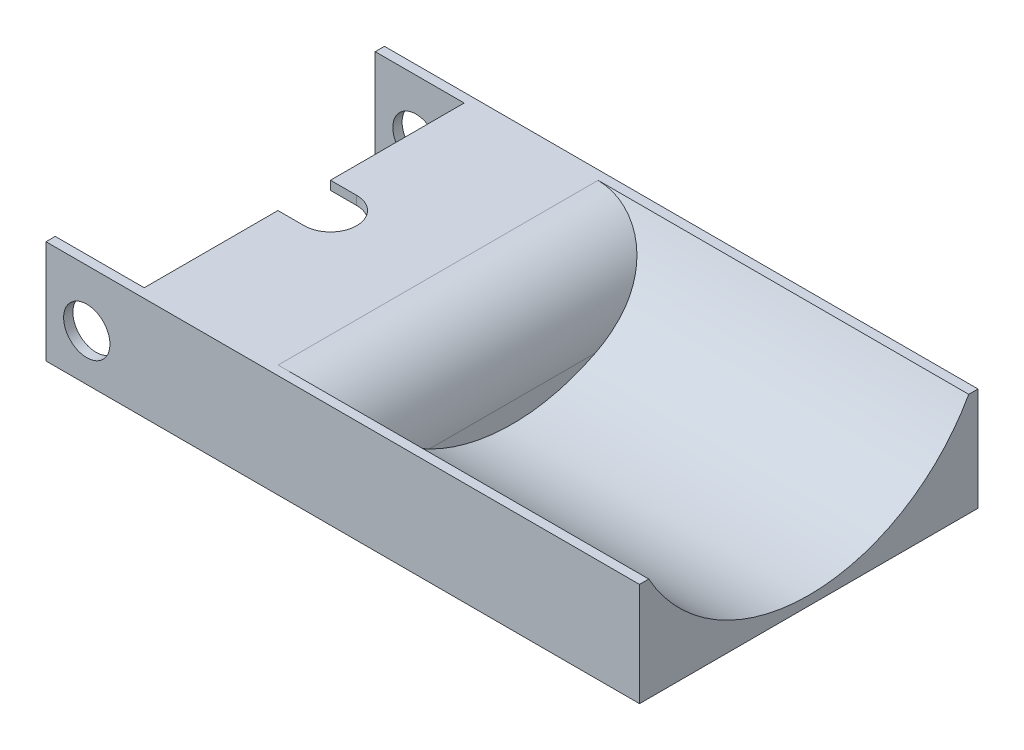
ISO-10303-21;
HEADER;
FILE_DESCRIPTION(('STEP AP214'),'2;1');
FILE_NAME('part.step','',(''),(''),'','','');
FILE_SCHEMA(('AUTOMOTIVE_DESIGN { 1 0 10303 214 1 1 1 1 }'));
ENDSEC;
DATA;
#1=APPLICATION_CONTEXT('core data for automotive mechanical design processes');
#2=APPLICATION_PROTOCOL_DEFINITION('international standard','automotive_design',2000,#1);
#3=PRODUCT_CONTEXT('',#1,'mechanical');
#4=PRODUCT('Part','Part','',(#3));
#5=PRODUCT_RELATED_PRODUCT_CATEGORY('part','',(#4));
#6=PRODUCT_DEFINITION_FORMATION('','',#4);
#7=PRODUCT_DEFINITION_CONTEXT('part definition',#1,'design');
#8=PRODUCT_DEFINITION('design','',#6,#7);
#9=PRODUCT_DEFINITION_SHAPE('','',#8);
#10=(LENGTH_UNIT() NAMED_UNIT(*) SI_UNIT(.MILLI.,.METRE.));
#11=(NAMED_UNIT(*) PLANE_ANGLE_UNIT() SI_UNIT($,.RADIAN.));
#12=(NAMED_UNIT(*) SI_UNIT($,.STERADIAN.) SOLID_ANGLE_UNIT());
#13=UNCERTAINTY_MEASURE_WITH_UNIT(LENGTH_MEASURE(1.E-05),#10,'distance_accuracy_value','');
#14=(GEOMETRIC_REPRESENTATION_CONTEXT(3) GLOBAL_UNCERTAINTY_ASSIGNED_CONTEXT((#13)) GLOBAL_UNIT_ASSIGNED_CONTEXT((#10,
#11,#12)) REPRESENTATION_CONTEXT('',''));
#15=CARTESIAN_POINT('',(0.,0.,0.));
#16=DIRECTION('',(0.,0.,1.));
#17=DIRECTION('',(1.,0.,0.));
#18=AXIS2_PLACEMENT_3D('',#15,#16,#17);
#19=CARTESIAN_POINT('',(15.24,-118.14937,-27.4066));
#20=DIRECTION('',(1.,0.,0.));
#21=DIRECTION('',(0.,0.,-1.));
#22=AXIS2_PLACEMENT_3D('',#19,#20,#21);
#23=PLANE('',#22);
#24=DIRECTION('',(0.,0.,-1.));
#25=VECTOR('',#24,1.);
#26=CARTESIAN_POINT('',(15.24,7.34187,-27.4066));
#27=LINE('',#26,#25);
#28=CARTESIAN_POINT('',(15.24,7.34186999999999,-4.49961));
#29=VERTEX_POINT('',#28);
#30=CARTESIAN_POINT('',(15.24,7.34187,-27.4066));
#31=VERTEX_POINT('',#30);
#32=EDGE_CURVE('E340',#29,#31,#27,.T.);
#33=ORIENTED_EDGE('',*,*,#32,.F.);
#34=DIRECTION('',(0.,1.,0.));
#35=VECTOR('',#34,1.);
#36=CARTESIAN_POINT('',(15.24,-118.14937,-4.49961000000002));
#37=LINE('',#36,#35);
#38=CARTESIAN_POINT('',(15.24,8.85063,-4.49961));
#39=VERTEX_POINT('',#38);
#40=EDGE_CURVE('E234',#29,#39,#37,.T.);
#41=ORIENTED_EDGE('',*,*,#40,.T.);
#42=DIRECTION('',(0.,0.,-1.));
#43=VECTOR('',#42,1.);
#44=CARTESIAN_POINT('',(15.24,8.85063,-27.4066));
#45=LINE('',#44,#43);
#46=CARTESIAN_POINT('',(15.24,8.85063,-27.4066));
#47=VERTEX_POINT('',#46);
#48=EDGE_CURVE('E377',#39,#47,#45,.T.);
#49=ORIENTED_EDGE('',*,*,#48,.T.);
#50=DIRECTION('',(0.,1.,0.));
#51=VECTOR('',#50,1.);
#52=CARTESIAN_POINT('',(15.24,-118.14937,-27.4066));
#53=LINE('',#52,#51);
#54=EDGE_CURVE('E182',#31,#47,#53,.T.);
#55=ORIENTED_EDGE('',*,*,#54,.F.);
#56=EDGE_LOOP('',(#33,#41,#49,#55));
#57=FACE_BOUND('',#56,.T.);
#58=ADVANCED_FACE('F39',(#57),#23,.F.);
#59=CARTESIAN_POINT('',(0.,-118.14937,-4.49961000000001));
#60=DIRECTION('',(0.,0.,-1.));
#61=DIRECTION('',(-1.,0.,0.));
#62=AXIS2_PLACEMENT_3D('',#59,#60,#61);
#63=PLANE('',#62);
#64=DIRECTION('',(1.,0.,0.));
#65=VECTOR('',#64,1.);
#66=CARTESIAN_POINT('',(101.681600522714,7.34186999999999,-4.49961000000002));
#67=LINE('',#66,#65);
#68=CARTESIAN_POINT('',(19.73961,7.34187,-4.49961));
#69=VERTEX_POINT('',#68);
#70=EDGE_CURVE('E176',#29,#69,#67,.T.);
#71=ORIENTED_EDGE('',*,*,#70,.T.);
#72=DIRECTION('',(0.,1.,0.));
#73=VECTOR('',#72,1.);
#74=CARTESIAN_POINT('',(19.73961,-118.14937,-4.49961000000002));
#75=LINE('',#74,#73);
#76=CARTESIAN_POINT('',(19.73961,8.85063,-4.49961));
#77=VERTEX_POINT('',#76);
#78=EDGE_CURVE('E373',#69,#77,#75,.T.);
#79=ORIENTED_EDGE('',*,*,#78,.T.);
#80=DIRECTION('',(-1.,0.,0.));
#81=VECTOR('',#80,1.);
#82=CARTESIAN_POINT('',(0.,8.85063,-4.49961));
#83=LINE('',#82,#81);
#84=EDGE_CURVE('E369',#77,#39,#83,.T.);
#85=ORIENTED_EDGE('',*,*,#84,.T.);
#86=ORIENTED_EDGE('',*,*,#40,.F.);
#87=EDGE_LOOP('',(#71,#79,#85,#86));
#88=FACE_BOUND('',#87,.T.);
#89=ADVANCED_FACE('F258',(#88),#63,.F.);
#90=CARTESIAN_POINT('',(19.73961,-118.14937,0.));
#91=DIRECTION('',(0.,1.,0.));
#92=DIRECTION('',(0.,0.,1.));
#93=AXIS2_PLACEMENT_3D('',#90,#91,#92);
#94=CYLINDRICAL_SURFACE('',#93,4.49961);
#95=CARTESIAN_POINT('',(19.73961,7.34187,0.));
#96=DIRECTION('',(0.,-1.,0.));
#97=DIRECTION('',(0.,0.,-1.));
#98=AXIS2_PLACEMENT_3D('',#95,#96,#97);
#99=CIRCLE('',#98,4.49961);
#100=CARTESIAN_POINT('',(19.73961,7.34187,4.49961));
#101=VERTEX_POINT('',#100);
#102=EDGE_CURVE('E166',#69,#101,#99,.T.);
#103=ORIENTED_EDGE('',*,*,#102,.T.);
#104=DIRECTION('',(0.,1.,0.));
#105=VECTOR('',#104,1.);
#106=CARTESIAN_POINT('',(19.73961,-118.14937,4.49960999999999));
#107=LINE('',#106,#105);
#108=CARTESIAN_POINT('',(19.73961,8.85063,4.49961));
#109=VERTEX_POINT('',#108);
#110=EDGE_CURVE('E372',#101,#109,#107,.T.);
#111=ORIENTED_EDGE('',*,*,#110,.T.);
#112=CARTESIAN_POINT('',(19.73961,8.85063,0.));
#113=DIRECTION('',(0.,1.,0.));
#114=DIRECTION('',(0.,0.,1.));
#115=AXIS2_PLACEMENT_3D('',#112,#113,#114);
#116=CIRCLE('',#115,4.49961);
#117=EDGE_CURVE('E366',#109,#77,#116,.T.);
#118=ORIENTED_EDGE('',*,*,#117,.T.);
#119=ORIENTED_EDGE('',*,*,#78,.F.);
#120=EDGE_LOOP('',(#103,#111,#118,#119));
#121=FACE_BOUND('',#120,.T.);
#122=ADVANCED_FACE('F262',(#121),#94,.F.);
#123=CARTESIAN_POINT('',(0.,-118.14937,4.49960999999998));
#124=DIRECTION('',(0.,0.,-1.));
#125=DIRECTION('',(-1.,0.,0.));
#126=AXIS2_PLACEMENT_3D('',#123,#124,#125);
#127=PLANE('',#126);
#128=ORIENTED_EDGE('',*,*,#110,.F.);
#129=DIRECTION('',(1.,0.,0.));
#130=VECTOR('',#129,1.);
#131=CARTESIAN_POINT('',(101.681600522714,7.34186999999999,4.49961000000002));
#132=LINE('',#131,#130);
#133=CARTESIAN_POINT('',(15.24,7.34187,4.49961));
#134=VERTEX_POINT('',#133);
#135=EDGE_CURVE('E175',#134,#101,#132,.T.);
#136=ORIENTED_EDGE('',*,*,#135,.F.);
#137=DIRECTION('',(0.,1.,0.));
#138=VECTOR('',#137,1.);
#139=CARTESIAN_POINT('',(15.24,-118.14937,4.49960999999999));
#140=LINE('',#139,#138);
#141=CARTESIAN_POINT('',(15.24,8.85063,4.49961));
#142=VERTEX_POINT('',#141);
#143=EDGE_CURVE('E174',#134,#142,#140,.T.);
#144=ORIENTED_EDGE('',*,*,#143,.T.);
#145=DIRECTION('',(-1.,0.,0.));
#146=VECTOR('',#145,1.);
#147=CARTESIAN_POINT('',(0.,8.85063,4.49961));
#148=LINE('',#147,#146);
#149=EDGE_CURVE('E362',#109,#142,#148,.T.);
#150=ORIENTED_EDGE('',*,*,#149,.F.);
#151=EDGE_LOOP('',(#128,#136,#144,#150));
#152=FACE_BOUND('',#151,.T.);
#153=ADVANCED_FACE('F266',(#152),#127,.T.);
#154=ORIENTED_EDGE('',*,*,#143,.F.);
#155=DIRECTION('',(0.,0.,1.));
#156=VECTOR('',#155,1.);
#157=CARTESIAN_POINT('',(15.24,7.34187,-28.9941));
#158=LINE('',#157,#156);
#159=CARTESIAN_POINT('',(15.24,7.34186999999999,27.4066));
#160=VERTEX_POINT('',#159);
#161=EDGE_CURVE('E56',#134,#160,#158,.T.);
#162=ORIENTED_EDGE('',*,*,#161,.T.);
#163=DIRECTION('',(0.,1.,0.));
#164=VECTOR('',#163,1.);
#165=CARTESIAN_POINT('',(15.24,-118.14937,27.4066));
#166=LINE('',#165,#164);
#167=CARTESIAN_POINT('',(15.24,8.85062999999999,27.4066));
#168=VERTEX_POINT('',#167);
#169=EDGE_CURVE('E172',#160,#168,#166,.T.);
#170=ORIENTED_EDGE('',*,*,#169,.T.);
#171=EDGE_CURVE('E187',#168,#142,#45,.T.);
#172=ORIENTED_EDGE('',*,*,#171,.T.);
#173=EDGE_LOOP('',(#154,#162,#170,#172));
#174=FACE_BOUND('',#173,.T.);
#175=ADVANCED_FACE('F170',(#174),#23,.F.);
#176=CARTESIAN_POINT('',(0.,0.,0.));
#177=DIRECTION('',(-1.,0.,0.));
#178=DIRECTION('',(0.,0.,1.));
#179=AXIS2_PLACEMENT_3D('',#176,#177,#178);
#180=PLANE('',#179);
#181=DIRECTION('',(0.,-1.,0.));
#182=VECTOR('',#181,1.);
#183=CARTESIAN_POINT('',(0.,0.,-27.4066));
#184=LINE('',#183,#182);
#185=CARTESIAN_POINT('',(0.,8.85063,-27.4066));
#186=VERTEX_POINT('',#185);
#187=CARTESIAN_POINT('',(0.,-8.85063000000001,-27.4066));
#188=VERTEX_POINT('',#187);
#189=EDGE_CURVE('E231',#186,#188,#184,.T.);
#190=ORIENTED_EDGE('',*,*,#189,.F.);
#191=DIRECTION('',(0.,0.,1.));
#192=VECTOR('',#191,1.);
#193=CARTESIAN_POINT('',(0.,8.85063,-28.9941));
#194=LINE('',#193,#192);
#195=CARTESIAN_POINT('',(0.,8.85063,-28.9941));
#196=VERTEX_POINT('',#195);
#197=EDGE_CURVE('E198',#196,#186,#194,.T.);
#198=ORIENTED_EDGE('',*,*,#197,.F.);
#199=DIRECTION('',(0.,-1.,0.));
#200=VECTOR('',#199,1.);
#201=CARTESIAN_POINT('',(0.,8.85063,-28.9941));
#202=LINE('',#201,#200);
#203=CARTESIAN_POINT('',(0.,-8.85063,-28.9941));
#204=VERTEX_POINT('',#203);
#205=EDGE_CURVE('E193',#196,#204,#202,.T.);
#206=ORIENTED_EDGE('',*,*,#205,.T.);
#207=DIRECTION('',(0.,0.,1.));
#208=VECTOR('',#207,1.);
#209=CARTESIAN_POINT('',(0.,-8.85063,-28.9941));
#210=LINE('',#209,#208);
#211=EDGE_CURVE('E211',#204,#188,#210,.T.);
#212=ORIENTED_EDGE('',*,*,#211,.T.);
#213=EDGE_LOOP('',(#190,#198,#206,#212));
#214=FACE_BOUND('',#213,.T.);
#215=ADVANCED_FACE('F290',(#214),#180,.T.);
#216=CARTESIAN_POINT('',(101.681600522714,8.85063,-28.9941));
#217=DIRECTION('',(0.,0.,-1.));
#218=DIRECTION('',(0.,1.,0.));
#219=AXIS2_PLACEMENT_3D('',#216,#217,#218);
#220=PLANE('',#219);
#221=CARTESIAN_POINT('',(6.985,-0.890269999999998,-28.9941));
#222=DIRECTION('',(0.,0.,-1.));
#223=DIRECTION('',(0.,1.,0.));
#224=AXIS2_PLACEMENT_3D('',#221,#222,#223);
#225=CIRCLE('',#224,3.96875);
#226=CARTESIAN_POINT('',(6.985,3.07848,-28.9941));
#227=VERTEX_POINT('',#226);
#228=EDGE_CURVE('E310',#227,#227,#225,.T.);
#229=ORIENTED_EDGE('',*,*,#228,.F.);
#230=EDGE_LOOP('',(#229));
#231=FACE_BOUND('',#230,.T.);
#232=ORIENTED_EDGE('',*,*,#205,.F.);
#233=DIRECTION('',(-1.,0.,0.));
#234=VECTOR('',#233,1.);
#235=CARTESIAN_POINT('',(101.681600522714,8.85063,-28.9941));
#236=LINE('',#235,#234);
#237=CARTESIAN_POINT('',(101.681600522714,8.85063,-28.9941));
#238=VERTEX_POINT('',#237);
#239=EDGE_CURVE('E220',#238,#196,#236,.T.);
#240=ORIENTED_EDGE('',*,*,#239,.F.);
#241=DIRECTION('',(0.,-1.,0.));
#242=VECTOR('',#241,1.);
#243=CARTESIAN_POINT('',(101.681600522714,8.85063,-28.9941));
#244=LINE('',#243,#242);
#245=CARTESIAN_POINT('',(101.681600522714,-8.85063,-28.9941));
#246=VERTEX_POINT('',#245);
#247=EDGE_CURVE('E194',#238,#246,#244,.T.);
#248=ORIENTED_EDGE('',*,*,#247,.T.);
#249=DIRECTION('',(-1.,0.,0.));
#250=VECTOR('',#249,1.);
#251=CARTESIAN_POINT('',(101.681600522714,-8.85063,-28.9941));
#252=LINE('',#251,#250);
#253=EDGE_CURVE('E207',#246,#204,#252,.T.);
#254=ORIENTED_EDGE('',*,*,#253,.T.);
#255=EDGE_LOOP('',(#232,#240,#248,#254));
#256=FACE_BOUND('',#255,.T.);
#257=ADVANCED_FACE('F295',(#231,#256),#220,.T.);
#258=CARTESIAN_POINT('',(101.681600522714,8.85063,-28.9941));
#259=DIRECTION('',(0.,-1.,0.));
#260=DIRECTION('',(0.,0.,-1.));
#261=AXIS2_PLACEMENT_3D('',#258,#259,#260);
#262=PLANE('',#261);
#263=DIRECTION('',(1.,0.,0.));
#264=VECTOR('',#263,1.);
#265=CARTESIAN_POINT('',(50.8816005227136,8.85062999999999,27.4066));
#266=LINE('',#265,#264);
#267=CARTESIAN_POINT('',(38.1816005227136,8.85062999999999,27.4066));
#268=VERTEX_POINT('',#267);
#269=CARTESIAN_POINT('',(101.681600522714,8.85063,27.4066));
#270=VERTEX_POINT('',#269);
#271=EDGE_CURVE('E64',#268,#270,#266,.T.);
#272=ORIENTED_EDGE('',*,*,#271,.F.);
#273=DIRECTION('',(0.,0.,1.));
#274=VECTOR('',#273,1.);
#275=CARTESIAN_POINT('',(38.1816005227136,8.85063,-27.4066));
#276=LINE('',#275,#274);
#277=CARTESIAN_POINT('',(38.1816005227136,8.85063,-27.4066));
#278=VERTEX_POINT('',#277);
#279=EDGE_CURVE('E239',#268,#278,#276,.F.);
#280=ORIENTED_EDGE('',*,*,#279,.T.);
#281=DIRECTION('',(1.,0.,0.));
#282=VECTOR('',#281,1.);
#283=CARTESIAN_POINT('',(50.8816005227136,8.85063,-27.4066));
#284=LINE('',#283,#282);
#285=CARTESIAN_POINT('',(101.681600522714,8.85063,-27.4066));
#286=VERTEX_POINT('',#285);
#287=EDGE_CURVE('E320',#278,#286,#284,.T.);
#288=ORIENTED_EDGE('',*,*,#287,.T.);
#289=DIRECTION('',(0.,0.,1.));
#290=VECTOR('',#289,1.);
#291=CARTESIAN_POINT('',(101.681600522714,8.85063,-28.9941));
#292=LINE('',#291,#290);
#293=EDGE_CURVE('E204',#238,#286,#292,.T.);
#294=ORIENTED_EDGE('',*,*,#293,.F.);
#295=ORIENTED_EDGE('',*,*,#239,.T.);
#296=ORIENTED_EDGE('',*,*,#197,.T.);
#297=DIRECTION('',(-1.,0.,0.));
#298=VECTOR('',#297,1.);
#299=CARTESIAN_POINT('',(0.,8.85063,-27.4066));
#300=LINE('',#299,#298);
#301=EDGE_CURVE('E183',#47,#186,#300,.T.);
#302=ORIENTED_EDGE('',*,*,#301,.F.);
#303=ORIENTED_EDGE('',*,*,#48,.F.);
#304=ORIENTED_EDGE('',*,*,#84,.F.);
#305=ORIENTED_EDGE('',*,*,#117,.F.);
#306=ORIENTED_EDGE('',*,*,#149,.T.);
#307=ORIENTED_EDGE('',*,*,#171,.F.);
#308=DIRECTION('',(1.,0.,0.));
#309=VECTOR('',#308,1.);
#310=CARTESIAN_POINT('',(0.,8.85062999999999,27.4066));
#311=LINE('',#310,#309);
#312=CARTESIAN_POINT('',(0.,8.85062999999999,27.4066));
#313=VERTEX_POINT('',#312);
#314=EDGE_CURVE('E180',#313,#168,#311,.T.);
#315=ORIENTED_EDGE('',*,*,#314,.F.);
#316=CARTESIAN_POINT('',(0.,8.85062999999999,28.9941));
#317=VERTEX_POINT('',#316);
#318=EDGE_CURVE('E217',#313,#317,#194,.T.);
#319=ORIENTED_EDGE('',*,*,#318,.T.);
#320=DIRECTION('',(-1.,0.,0.));
#321=VECTOR('',#320,1.);
#322=CARTESIAN_POINT('',(101.681600522714,8.85062999999999,28.9941));
#323=LINE('',#322,#321);
#324=CARTESIAN_POINT('',(101.681600522714,8.85062999999999,28.9941));
#325=VERTEX_POINT('',#324);
#326=EDGE_CURVE('E223',#325,#317,#323,.T.);
#327=ORIENTED_EDGE('',*,*,#326,.F.);
#328=EDGE_CURVE('E203',#270,#325,#292,.T.);
#329=ORIENTED_EDGE('',*,*,#328,.F.);
#330=EDGE_LOOP('',(#272,#280,#288,#294,#295,#296,#302,#303,#304,#305,#306,#307,#315,#319,#327,#329));
#331=FACE_BOUND('',#330,.T.);
#332=ADVANCED_FACE('F291',(#331),#262,.F.);
#333=CARTESIAN_POINT('',(101.681600522714,8.85062999999999,28.9941));
#334=DIRECTION('',(0.,0.,-1.));
#335=DIRECTION('',(0.,1.,0.));
#336=AXIS2_PLACEMENT_3D('',#333,#334,#335);
#337=PLANE('',#336);
#338=CARTESIAN_POINT('',(6.985,-0.89027000000001,28.9941));
#339=DIRECTION('',(0.,0.,-1.));
#340=DIRECTION('',(0.,1.,0.));
#341=AXIS2_PLACEMENT_3D('',#338,#339,#340);
#342=CIRCLE('',#341,3.96875);
#343=CARTESIAN_POINT('',(6.985,3.07847999999999,28.9941));
#344=VERTEX_POINT('',#343);
#345=EDGE_CURVE('E353',#344,#344,#342,.T.);
#346=ORIENTED_EDGE('',*,*,#345,.T.);
#347=EDGE_LOOP('',(#346));
#348=FACE_BOUND('',#347,.T.);
#349=DIRECTION('',(0.,-1.,0.));
#350=VECTOR('',#349,1.);
#351=CARTESIAN_POINT('',(0.,8.85062999999999,28.9941));
#352=LINE('',#351,#350);
#353=CARTESIAN_POINT('',(0.,-8.85063000000001,28.9941));
#354=VERTEX_POINT('',#353);
#355=EDGE_CURVE('E214',#317,#354,#352,.T.);
#356=ORIENTED_EDGE('',*,*,#355,.T.);
#357=DIRECTION('',(-1.,0.,0.));
#358=VECTOR('',#357,1.);
#359=CARTESIAN_POINT('',(101.681600522714,-8.85063000000001,28.9941));
#360=LINE('',#359,#358);
#361=CARTESIAN_POINT('',(101.681600522714,-8.85063000000001,28.9941));
#362=VERTEX_POINT('',#361);
#363=EDGE_CURVE('E226',#362,#354,#360,.T.);
#364=ORIENTED_EDGE('',*,*,#363,.F.);
#365=DIRECTION('',(0.,-1.,0.));
#366=VECTOR('',#365,1.);
#367=CARTESIAN_POINT('',(101.681600522714,8.85062999999999,28.9941));
#368=LINE('',#367,#366);
#369=EDGE_CURVE('E201',#325,#362,#368,.T.);
#370=ORIENTED_EDGE('',*,*,#369,.F.);
#371=ORIENTED_EDGE('',*,*,#326,.T.);
#372=EDGE_LOOP('',(#356,#364,#370,#371));
#373=FACE_BOUND('',#372,.T.);
#374=ADVANCED_FACE('F294',(#348,#373),#337,.F.);
#375=CARTESIAN_POINT('',(101.681600522714,-8.85063,-28.9941));
#376=DIRECTION('',(0.,-1.,0.));
#377=DIRECTION('',(0.,0.,-1.));
#378=AXIS2_PLACEMENT_3D('',#375,#376,#377);
#379=PLANE('',#378);
#380=DIRECTION('',(0.,0.,1.));
#381=VECTOR('',#380,1.);
#382=CARTESIAN_POINT('',(38.18128,-8.85063,27.4066));
#383=LINE('',#382,#381);
#384=CARTESIAN_POINT('',(38.18128,-8.85063,-27.4066));
#385=VERTEX_POINT('',#384);
#386=CARTESIAN_POINT('',(38.18128,-8.85063,27.4066));
#387=VERTEX_POINT('',#386);
#388=EDGE_CURVE('E329',#385,#387,#383,.T.);
#389=ORIENTED_EDGE('',*,*,#388,.F.);
#390=DIRECTION('',(1.,0.,0.));
#391=VECTOR('',#390,1.);
#392=CARTESIAN_POINT('',(101.681600522714,-8.85063,-27.4066));
#393=LINE('',#392,#391);
#394=EDGE_CURVE('E191',#188,#385,#393,.T.);
#395=ORIENTED_EDGE('',*,*,#394,.F.);
#396=ORIENTED_EDGE('',*,*,#211,.F.);
#397=ORIENTED_EDGE('',*,*,#253,.F.);
#398=DIRECTION('',(0.,0.,1.));
#399=VECTOR('',#398,1.);
#400=CARTESIAN_POINT('',(101.681600522714,-8.85063,-28.9941));
#401=LINE('',#400,#399);
#402=EDGE_CURVE('E197',#246,#362,#401,.T.);
#403=ORIENTED_EDGE('',*,*,#402,.T.);
#404=ORIENTED_EDGE('',*,*,#363,.T.);
#405=CARTESIAN_POINT('',(0.,-8.85063000000001,27.4066));
#406=VERTEX_POINT('',#405);
#407=EDGE_CURVE('E210',#406,#354,#210,.T.);
#408=ORIENTED_EDGE('',*,*,#407,.F.);
#409=DIRECTION('',(-1.,0.,0.));
#410=VECTOR('',#409,1.);
#411=CARTESIAN_POINT('',(101.681600522714,-8.85063000000001,27.4066));
#412=LINE('',#411,#410);
#413=EDGE_CURVE('E185',#387,#406,#412,.T.);
#414=ORIENTED_EDGE('',*,*,#413,.F.);
#415=EDGE_LOOP('',(#389,#395,#396,#397,#403,#404,#408,#414));
#416=FACE_BOUND('',#415,.T.);
#417=ADVANCED_FACE('F285',(#416),#379,.T.);
#418=CARTESIAN_POINT('',(101.681600522714,0.,0.));
#419=DIRECTION('',(-1.,0.,0.));
#420=DIRECTION('',(0.,0.,1.));
#421=AXIS2_PLACEMENT_3D('',#418,#419,#420);
#422=PLANE('',#421);
#423=ORIENTED_EDGE('',*,*,#293,.T.);
#424=CARTESIAN_POINT('',(101.681600522714,24.1005922131148,0.));
#425=DIRECTION('',(1.,0.,0.));
#426=DIRECTION('',(0.,0.,-1.));
#427=AXIS2_PLACEMENT_3D('',#424,#425,#426);
#428=CIRCLE('',#427,31.3637222131148);
#429=EDGE_CURVE('E356',#270,#286,#428,.T.);
#430=ORIENTED_EDGE('',*,*,#429,.F.);
#431=ORIENTED_EDGE('',*,*,#328,.T.);
#432=ORIENTED_EDGE('',*,*,#369,.T.);
#433=ORIENTED_EDGE('',*,*,#402,.F.);
#434=ORIENTED_EDGE('',*,*,#247,.F.);
#435=EDGE_LOOP('',(#423,#430,#431,#432,#433,#434));
#436=FACE_BOUND('',#435,.T.);
#437=ADVANCED_FACE('F282',(#436),#422,.F.);
#438=DIRECTION('',(0.,1.,0.));
#439=VECTOR('',#438,1.);
#440=CARTESIAN_POINT('',(0.,0.,27.4066));
#441=LINE('',#440,#439);
#442=EDGE_CURVE('E222',#406,#313,#441,.T.);
#443=ORIENTED_EDGE('',*,*,#442,.F.);
#444=ORIENTED_EDGE('',*,*,#407,.T.);
#445=ORIENTED_EDGE('',*,*,#355,.F.);
#446=ORIENTED_EDGE('',*,*,#318,.F.);
#447=EDGE_LOOP('',(#443,#444,#445,#446));
#448=FACE_BOUND('',#447,.T.);
#449=ADVANCED_FACE('F274',(#448),#180,.T.);
#450=CARTESIAN_POINT('',(0.,-118.14937,-27.4066));
#451=DIRECTION('',(0.,0.,-1.));
#452=DIRECTION('',(0.,1.,0.));
#453=AXIS2_PLACEMENT_3D('',#450,#451,#452);
#454=PLANE('',#453);
#455=CARTESIAN_POINT('',(6.985,-0.890269999999998,-27.4066));
#456=DIRECTION('',(0.,0.,-1.));
#457=DIRECTION('',(0.,1.,0.));
#458=AXIS2_PLACEMENT_3D('',#455,#456,#457);
#459=CIRCLE('',#458,3.96875);
#460=CARTESIAN_POINT('',(6.985,3.07848,-27.4066));
#461=VERTEX_POINT('',#460);
#462=EDGE_CURVE('E350',#461,#461,#459,.T.);
#463=ORIENTED_EDGE('',*,*,#462,.T.);
#464=EDGE_LOOP('',(#463));
#465=FACE_BOUND('',#464,.T.);
#466=ORIENTED_EDGE('',*,*,#394,.T.);
#467=DIRECTION('',(0.,1.,0.));
#468=VECTOR('',#467,1.);
#469=CARTESIAN_POINT('',(38.18128,-156.832437526763,-27.4066));
#470=LINE('',#469,#468);
#471=CARTESIAN_POINT('',(38.18128,7.34187,-27.4066));
#472=VERTEX_POINT('',#471);
#473=EDGE_CURVE('E334',#385,#472,#470,.T.);
#474=ORIENTED_EDGE('',*,*,#473,.T.);
#475=DIRECTION('',(1.,0.,0.));
#476=VECTOR('',#475,1.);
#477=CARTESIAN_POINT('',(38.18128,7.34187,-27.4066));
#478=LINE('',#477,#476);
#479=EDGE_CURVE('E592',#31,#472,#478,.T.);
#480=ORIENTED_EDGE('',*,*,#479,.F.);
#481=ORIENTED_EDGE('',*,*,#54,.T.);
#482=ORIENTED_EDGE('',*,*,#301,.T.);
#483=ORIENTED_EDGE('',*,*,#189,.T.);
#484=EDGE_LOOP('',(#466,#474,#480,#481,#482,#483));
#485=FACE_BOUND('',#484,.T.);
#486=ADVANCED_FACE('F271',(#465,#485),#454,.F.);
#487=CARTESIAN_POINT('',(0.,-118.14937,27.4066));
#488=DIRECTION('',(0.,0.,1.));
#489=DIRECTION('',(0.,-1.,0.));
#490=AXIS2_PLACEMENT_3D('',#487,#488,#489);
#491=PLANE('',#490);
#492=CARTESIAN_POINT('',(6.985,-0.890270000000009,27.4066));
#493=DIRECTION('',(0.,0.,1.));
#494=DIRECTION('',(0.,-1.,0.));
#495=AXIS2_PLACEMENT_3D('',#492,#493,#494);
#496=CIRCLE('',#495,3.96875);
#497=CARTESIAN_POINT('',(6.985,-4.85902000000001,27.4066));
#498=VERTEX_POINT('',#497);
#499=EDGE_CURVE('E44',#498,#498,#496,.T.);
#500=ORIENTED_EDGE('',*,*,#499,.T.);
#501=EDGE_LOOP('',(#500));
#502=FACE_BOUND('',#501,.T.);
#503=ORIENTED_EDGE('',*,*,#413,.T.);
#504=ORIENTED_EDGE('',*,*,#442,.T.);
#505=ORIENTED_EDGE('',*,*,#314,.T.);
#506=ORIENTED_EDGE('',*,*,#169,.F.);
#507=DIRECTION('',(-1.,0.,0.));
#508=VECTOR('',#507,1.);
#509=CARTESIAN_POINT('',(38.18128,7.34187,27.4066));
#510=LINE('',#509,#508);
#511=CARTESIAN_POINT('',(38.18128,7.34186999999999,27.4066));
#512=VERTEX_POINT('',#511);
#513=EDGE_CURVE('E158',#512,#160,#510,.T.);
#514=ORIENTED_EDGE('',*,*,#513,.F.);
#515=DIRECTION('',(0.,1.,0.));
#516=VECTOR('',#515,1.);
#517=CARTESIAN_POINT('',(38.18128,-156.832437526763,27.4066));
#518=LINE('',#517,#516);
#519=EDGE_CURVE('E337',#387,#512,#518,.T.);
#520=ORIENTED_EDGE('',*,*,#519,.F.);
#521=EDGE_LOOP('',(#503,#504,#505,#506,#514,#520));
#522=FACE_BOUND('',#521,.T.);
#523=ADVANCED_FACE('F178',(#502,#522),#491,.F.);
#524=CARTESIAN_POINT('',(50.8816005227136,24.1005922131148,0.));
#525=DIRECTION('',(1.,0.,0.));
#526=DIRECTION('',(0.,0.,-1.));
#527=AXIS2_PLACEMENT_3D('',#524,#525,#526);
#528=CYLINDRICAL_SURFACE('',#527,31.3637222131148);
#529=ORIENTED_EDGE('',*,*,#429,.T.);
#530=ORIENTED_EDGE('',*,*,#287,.F.);
#531=CARTESIAN_POINT('',(38.1816005227136,8.85063,-27.4066));
#532=CARTESIAN_POINT('',(38.339530464058,8.85063086387475,-27.4065985056174));
#533=CARTESIAN_POINT('',(38.4974407201365,8.84768350137735,-27.4049607213441));
#534=CARTESIAN_POINT('',(38.8129696489091,8.83590882835846,-27.3984046577779));
#535=CARTESIAN_POINT('',(38.9705883288741,8.82708166649472,-27.3934864614231));
#536=CARTESIAN_POINT('',(39.4425414001564,8.79181243352002,-27.3738033990207));
#537=CARTESIAN_POINT('',(39.7560727891147,8.75658259366937,-27.3541100680787));
#538=CARTESIAN_POINT('',(40.3779305962958,8.66321737022165,-27.3015269231784));
#539=CARTESIAN_POINT('',(40.6862657264328,8.60512537234216,-27.2686621027144));
#540=CARTESIAN_POINT('',(41.2961795055692,8.46676430822756,-27.1895722878167));
#541=CARTESIAN_POINT('',(41.5977581993355,8.3864953889796,-27.1433473819327));
#542=CARTESIAN_POINT('',(42.1921109061037,8.20477493498361,-27.0373282754128));
#543=CARTESIAN_POINT('',(42.4848822787756,8.10331711904814,-26.9775300506761));
#544=CARTESIAN_POINT('',(43.0595337945439,7.88053755745986,-26.8441751255695));
#545=CARTESIAN_POINT('',(43.341413697885,7.75921537483759,-26.7706181225338));
#546=CARTESIAN_POINT('',(43.8923916398436,7.49830656656404,-26.6095971855517));
#547=CARTESIAN_POINT('',(44.1614918004876,7.35872298770133,-26.5221355709716));
#548=CARTESIAN_POINT('',(44.6853370906497,7.063093872602,-26.3332010668508));
#549=CARTESIAN_POINT('',(44.9400821531453,6.90704825951554,-26.2317281119001));
#550=CARTESIAN_POINT('',(45.4371769762952,6.5783140799544,-26.0133098109472));
#551=CARTESIAN_POINT('',(45.6793136236954,6.40542969287447,-25.8961745112317));
#552=CARTESIAN_POINT('',(46.1463237529269,6.04708492574557,-25.6476407456658));
#553=CARTESIAN_POINT('',(46.3711971806305,5.86162450626863,-25.5162422350971));
#554=CARTESIAN_POINT('',(46.8029576727053,5.48042938671135,-25.2394153862362));
#555=CARTESIAN_POINT('',(47.0098407071782,5.28469240031854,-25.093983919835));
#556=CARTESIAN_POINT('',(47.4051475979739,4.88533859075429,-24.7895168859298));
#557=CARTESIAN_POINT('',(47.5935707048579,4.68172144813096,-24.6304807665927));
#558=CARTESIAN_POINT('',(47.965635769296,4.25305338109769,-24.2866100040541));
#559=CARTESIAN_POINT('',(48.147799720115,4.02755716447779,-24.1007320898275));
#560=CARTESIAN_POINT('',(48.4909311567789,3.57281686408587,-23.7146051912346));
#561=CARTESIAN_POINT('',(48.6518979826065,3.34357266386216,-23.5143557596804));
#562=CARTESIAN_POINT('',(48.9533372673469,2.88377734220187,-23.1003362194435));
#563=CARTESIAN_POINT('',(49.093806485762,2.65322602009256,-22.886563980561));
#564=CARTESIAN_POINT('',(49.3552119697813,2.19301980480089,-22.4464436757676));
#565=CARTESIAN_POINT('',(49.4761438658321,1.96336512332993,-22.2200928117984));
#566=CARTESIAN_POINT('',(49.7591202739538,1.38538379143174,-21.6321710933283));
#567=CARTESIAN_POINT('',(49.9087975033477,1.03893947748194,-21.2627410894325));
#568=CARTESIAN_POINT('',(50.1698991011728,0.358213584963321,-20.4998609931956));
#569=CARTESIAN_POINT('',(50.2813040526045,0.0239382568467261,-20.1063988272827));
#570=CARTESIAN_POINT('',(50.4712671636712,-0.629116144337422,-19.2975512769457));
#571=CARTESIAN_POINT('',(50.549738298715,-0.947852218766553,-18.8821110350116));
#572=CARTESIAN_POINT('',(50.6786048688822,-1.56584127777812,-18.0331086103743));
#573=CARTESIAN_POINT('',(50.7290081160926,-1.86509966305323,-17.5995515062591));
#574=CARTESIAN_POINT('',(50.8095253695283,-2.4627255668621,-16.6850926313775));
#575=CARTESIAN_POINT('',(50.8379445522593,-2.75952094888347,-16.2030150566774));
#576=CARTESIAN_POINT('',(50.8649492959249,-3.1840969028188,-15.4695848272262));
#577=CARTESIAN_POINT('',(50.8713509161973,-3.32179412176606,-15.2241590798093));
#578=CARTESIAN_POINT('',(50.8796743896278,-3.5905748971085,-14.7296138193891));
#579=CARTESIAN_POINT('',(50.8815959357296,-3.72165799958159,-14.480494054382));
#580=CARTESIAN_POINT('',(50.8816005227136,-3.84937,-14.2296410125795));
#581=B_SPLINE_CURVE_WITH_KNOTS('',3,(#531,#532,#533,#534,#535,#536,#537,#538,#539,#540,#541,
#542,#543,#544,#545,#546,#547,#548,#549,#550,#551,#552,#553,#554,#555,#556,#557,#558,#559,#560,
#561,#562,#563,#564,#565,#566,#567,#568,#569,#570,#571,#572,#573,#574,#575,#576,#577,#578,#579,
#580),.UNSPECIFIED.,.F.,.F.,(4,2,2,2,2,2,2,2,2,2,2,2,2,2,2,2,2,2,2,2,2,2,2,2,4),(0.,
0.47371455860092,0.947417140828898,1.89452339341597,2.83984091443319,3.78515217009975,
4.73074405041736,5.67635673433291,6.62181184998854,7.5672713795139,8.52546268278292,
9.48365699028212,10.4420653860375,11.4005126752783,12.4325530764299,13.4646256047506,
14.4968611186169,15.5293271749638,17.1112133116118,18.6939008188547,20.2807444957337,
21.8671462881006,23.5661944342636,24.4105440039646,25.254951442175),.UNSPECIFIED.);
#582=CARTESIAN_POINT('',(50.8816005227136,-3.84937,-14.2296410125795));
#583=VERTEX_POINT('',#582);
#584=EDGE_CURVE('E11',#278,#583,#581,.T.);
#585=ORIENTED_EDGE('',*,*,#584,.T.);
#586=CARTESIAN_POINT('',(50.8816005227136,24.1005922131148,0.));
#587=DIRECTION('',(1.,0.,0.));
#588=DIRECTION('',(0.,0.,-1.));
#589=AXIS2_PLACEMENT_3D('',#586,#587,#588);
#590=CIRCLE('',#589,31.3637222131148);
#591=CARTESIAN_POINT('',(50.8816005227136,-3.84937,14.2296410125795));
#592=VERTEX_POINT('',#591);
#593=EDGE_CURVE('E357',#592,#583,#590,.T.);
#594=ORIENTED_EDGE('',*,*,#593,.F.);
#595=CARTESIAN_POINT('',(50.8816005227136,-3.84937,14.2296410125795));
#596=CARTESIAN_POINT('',(50.8815901918858,-3.69808800262788,14.526802375515));
#597=CARTESIAN_POINT('',(50.8788966773642,-3.54204737517398,14.8215655403961));
#598=CARTESIAN_POINT('',(50.8670518037961,-3.22067304429458,15.4059293661342));
#599=CARTESIAN_POINT('',(50.8578990350911,-3.05533731957056,15.6955288859375));
#600=CARTESIAN_POINT('',(50.8320019058823,-2.71512039593503,16.2699858137167));
#601=CARTESIAN_POINT('',(50.8152333734445,-2.54021037545688,16.5548251054527));
#602=CARTESIAN_POINT('',(50.7729243968978,-2.18169267461386,17.1182961669115));
#603=CARTESIAN_POINT('',(50.7473845196434,-1.99808555696591,17.3969283365353));
#604=CARTESIAN_POINT('',(50.6859615707413,-1.62047895572817,17.9505739540829));
#605=CARTESIAN_POINT('',(50.6499647798823,-1.42638541781876,18.2255108280053));
#606=CARTESIAN_POINT('',(50.5664291450031,-1.03033171903365,18.767857408365));
#607=CARTESIAN_POINT('',(50.518890910671,-0.828371974171009,19.0352675115788));
#608=CARTESIAN_POINT('',(50.4109843005738,-0.417576341537055,19.5615373832509));
#609=CARTESIAN_POINT('',(50.3506330667713,-0.208749952725956,19.8204080468719));
#610=CARTESIAN_POINT('',(50.2157053606609,0.215082364493061,20.3291688319419));
#611=CARTESIAN_POINT('',(50.141131205825,0.430087281335594,20.5790604085645));
#612=CARTESIAN_POINT('',(49.959411370223,0.910028260732757,21.1195849731056));
#613=CARTESIAN_POINT('',(49.8487207209037,1.17612904692754,21.4080108908989));
#614=CARTESIAN_POINT('',(49.6023561010492,1.71333156172421,21.9691716931148));
#615=CARTESIAN_POINT('',(49.4666820705209,1.9844333023336,22.241906539856));
#616=CARTESIAN_POINT('',(49.1688519888635,2.52760815099379,22.769104033655));
#617=CARTESIAN_POINT('',(49.0067991925711,2.79967357981944,23.0236325675454));
#618=CARTESIAN_POINT('',(48.6541934856688,3.3422537298626,23.5139992485516));
#619=CARTESIAN_POINT('',(48.4636410280561,3.612768475657,23.7498376926521));
#620=CARTESIAN_POINT('',(48.050559511492,4.15126080408919,24.2039815934201));
#621=CARTESIAN_POINT('',(47.8276868366202,4.4191730886763,24.4220533273284));
#622=CARTESIAN_POINT('',(47.3512537129699,4.94455879895256,24.8362917988393));
#623=CARTESIAN_POINT('',(47.0976921702555,5.20203185208776,25.0324577551088));
#624=CARTESIAN_POINT('',(46.5603559257774,5.70160072495888,25.401904641193));
#625=CARTESIAN_POINT('',(46.27657599804,5.943693873295,25.5751816009331));
#626=CARTESIAN_POINT('',(45.6803325778217,6.40741115085647,25.8981521861865));
#627=CARTESIAN_POINT('',(45.3678745582716,6.62903916952144,26.0478502967407));
#628=CARTESIAN_POINT('',(44.762682988124,7.01754473440518,26.3039700786196));
#629=CARTESIAN_POINT('',(44.4733884993613,7.18773497496009,26.4135177053163));
#630=CARTESIAN_POINT('',(43.8774281528605,7.50676221997052,26.6150990504434));
#631=CARTESIAN_POINT('',(43.5707632604518,7.6556004094077,26.7071337408874));
#632=CARTESIAN_POINT('',(42.9426438414134,7.92941609639875,26.8738131937313));
#633=CARTESIAN_POINT('',(42.6211977700175,8.05440702960184,26.948467753426));
#634=CARTESIAN_POINT('',(41.9660664092132,8.27859834173638,27.0807044407073));
#635=CARTESIAN_POINT('',(41.6323835383493,8.37780378603062,27.1382899216971));
#636=CARTESIAN_POINT('',(41.0416191142025,8.52714662472231,27.2241849430995));
#637=CARTESIAN_POINT('',(40.786585359845,8.5833472932128,27.2562153782192));
#638=CARTESIAN_POINT('',(40.2726173628598,8.68003537806264,27.3110340194002));
#639=CARTESIAN_POINT('',(40.0136839967402,8.72052627229643,27.3338242711297));
#640=CARTESIAN_POINT('',(39.4932550635123,8.7854339108507,27.3702477241569));
#641=CARTESIAN_POINT('',(39.2317602878428,8.80985547066841,27.3838836687504));
#642=CARTESIAN_POINT('',(38.7073791174649,8.8424679858377,27.4020577540479));
#643=CARTESIAN_POINT('',(38.4444923841603,8.8506547912788,27.40659356859));
#644=CARTESIAN_POINT('',(38.1816005227136,8.85062999999999,27.4066));
#645=B_SPLINE_CURVE_WITH_KNOTS('',3,(#595,#596,#597,#598,#599,#600,#601,#602,#603,#604,#605,
#606,#607,#608,#609,#610,#611,#612,#613,#614,#615,#616,#617,#618,#619,#620,#621,#622,#623,#624,
#625,#626,#627,#628,#629,#630,#631,#632,#633,#634,#635,#636,#637,#638,#639,#640,#641,#642,#643,
#644),.UNSPECIFIED.,.F.,.F.,(4,2,2,2,2,2,2,2,2,2,2,2,2,2,2,2,2,2,2,2,2,2,2,2,4),(0.,
1.00033942389144,2.00089722796829,3.0046531729968,4.00834426178873,5.02338757413897,
6.03837727749827,7.05201753148488,8.06549276457248,9.28766896971,10.5098481097246,
11.7273534754148,12.9448394911209,14.1763745059723,15.4079534330721,16.6397456966571,
17.8713033716965,18.9290632151949,19.9867643331266,21.0438677663918,22.1007633825299,
22.889473376713,23.6780086642712,24.466307543722,25.2548079013249),.UNSPECIFIED.);
#646=EDGE_CURVE('E49',#592,#268,#645,.T.);
#647=ORIENTED_EDGE('',*,*,#646,.T.);
#648=ORIENTED_EDGE('',*,*,#271,.T.);
#649=EDGE_LOOP('',(#529,#530,#585,#594,#647,#648));
#650=FACE_BOUND('',#649,.T.);
#651=ADVANCED_FACE('F250',(#650),#528,.F.);
#652=CARTESIAN_POINT('',(50.8816005227136,0.,0.));
#653=DIRECTION('',(1.,0.,0.));
#654=DIRECTION('',(0.,0.,-1.));
#655=AXIS2_PLACEMENT_3D('',#652,#653,#654);
#656=PLANE('',#655);
#657=ORIENTED_EDGE('',*,*,#593,.T.);
#658=DIRECTION('',(0.,0.,1.));
#659=VECTOR('',#658,1.);
#660=CARTESIAN_POINT('',(50.8816005227136,-3.84937000000001,27.4066));
#661=LINE('',#660,#659);
#662=EDGE_CURVE('E236',#583,#592,#661,.T.);
#663=ORIENTED_EDGE('',*,*,#662,.T.);
#664=EDGE_LOOP('',(#657,#663));
#665=FACE_BOUND('',#664,.T.);
#666=ADVANCED_FACE('F255',(#665),#656,.T.);
#667=CARTESIAN_POINT('',(38.1816005227136,-3.84937,0.));
#668=DIRECTION('',(0.,0.,-1.));
#669=DIRECTION('',(0.,1.,0.));
#670=AXIS2_PLACEMENT_3D('',#667,#668,#669);
#671=CYLINDRICAL_SURFACE('',#670,12.7);
#672=ORIENTED_EDGE('',*,*,#584,.F.);
#673=ORIENTED_EDGE('',*,*,#279,.F.);
#674=ORIENTED_EDGE('',*,*,#646,.F.);
#675=ORIENTED_EDGE('',*,*,#662,.F.);
#676=EDGE_LOOP('',(#672,#673,#674,#675));
#677=FACE_BOUND('',#676,.T.);
#678=ADVANCED_FACE('F41',(#677),#671,.T.);
#679=CARTESIAN_POINT('',(6.985,-0.890270000000016,59.9059));
#680=DIRECTION('',(0.,0.,-1.));
#681=DIRECTION('',(0.,1.,0.));
#682=AXIS2_PLACEMENT_3D('',#679,#680,#681);
#683=CYLINDRICAL_SURFACE('',#682,3.96875);
#684=ORIENTED_EDGE('',*,*,#499,.F.);
#685=EDGE_LOOP('',(#684));
#686=FACE_BOUND('',#685,.T.);
#687=ORIENTED_EDGE('',*,*,#345,.F.);
#688=EDGE_LOOP('',(#687));
#689=FACE_BOUND('',#688,.T.);
#690=ADVANCED_FACE('F402',(#686,#689),#683,.F.);
#691=ORIENTED_EDGE('',*,*,#228,.T.);
#692=EDGE_LOOP('',(#691));
#693=FACE_BOUND('',#692,.T.);
#694=ORIENTED_EDGE('',*,*,#462,.F.);
#695=EDGE_LOOP('',(#694));
#696=FACE_BOUND('',#695,.T.);
#697=ADVANCED_FACE('F406',(#693,#696),#683,.F.);
#698=CARTESIAN_POINT('',(38.18128,-156.832437526763,27.4066));
#699=DIRECTION('',(-1.,0.,0.));
#700=DIRECTION('',(0.,0.,1.));
#701=AXIS2_PLACEMENT_3D('',#698,#699,#700);
#702=PLANE('',#701);
#703=ORIENTED_EDGE('',*,*,#473,.F.);
#704=ORIENTED_EDGE('',*,*,#388,.T.);
#705=ORIENTED_EDGE('',*,*,#519,.T.);
#706=DIRECTION('',(0.,0.,1.));
#707=VECTOR('',#706,1.);
#708=CARTESIAN_POINT('',(38.18128,7.34187,27.4066));
#709=LINE('',#708,#707);
#710=EDGE_CURVE('E161',#472,#512,#709,.T.);
#711=ORIENTED_EDGE('',*,*,#710,.F.);
#712=EDGE_LOOP('',(#703,#704,#705,#711));
#713=FACE_BOUND('',#712,.T.);
#714=ADVANCED_FACE('F336',(#713),#702,.T.);
#715=CARTESIAN_POINT('',(101.681600522714,7.34187,-28.9941));
#716=DIRECTION('',(0.,-1.,0.));
#717=DIRECTION('',(0.,0.,-1.));
#718=AXIS2_PLACEMENT_3D('',#715,#716,#717);
#719=PLANE('',#718);
#720=ORIENTED_EDGE('',*,*,#513,.T.);
#721=ORIENTED_EDGE('',*,*,#161,.F.);
#722=ORIENTED_EDGE('',*,*,#135,.T.);
#723=ORIENTED_EDGE('',*,*,#102,.F.);
#724=ORIENTED_EDGE('',*,*,#70,.F.);
#725=ORIENTED_EDGE('',*,*,#32,.T.);
#726=ORIENTED_EDGE('',*,*,#479,.T.);
#727=ORIENTED_EDGE('',*,*,#710,.T.);
#728=EDGE_LOOP('',(#720,#721,#722,#723,#724,#725,#726,#727));
#729=FACE_BOUND('',#728,.T.);
#730=ADVANCED_FACE('F159',(#729),#719,.T.);
#731=CLOSED_SHELL('',(#58,#89,#122,#153,#175,#215,#257,#332,#374,#417,#437,#449,#486,#523,#651,
#666,#678,#690,#697,#714,#730));
#732=MANIFOLD_SOLID_BREP('B2',#731);
#733=ADVANCED_BREP_SHAPE_REPRESENTATION('',(#18,#732),#14);
#734=SHAPE_DEFINITION_REPRESENTATION(#9,#733);
ENDSEC;
END-ISO-10303-21;
